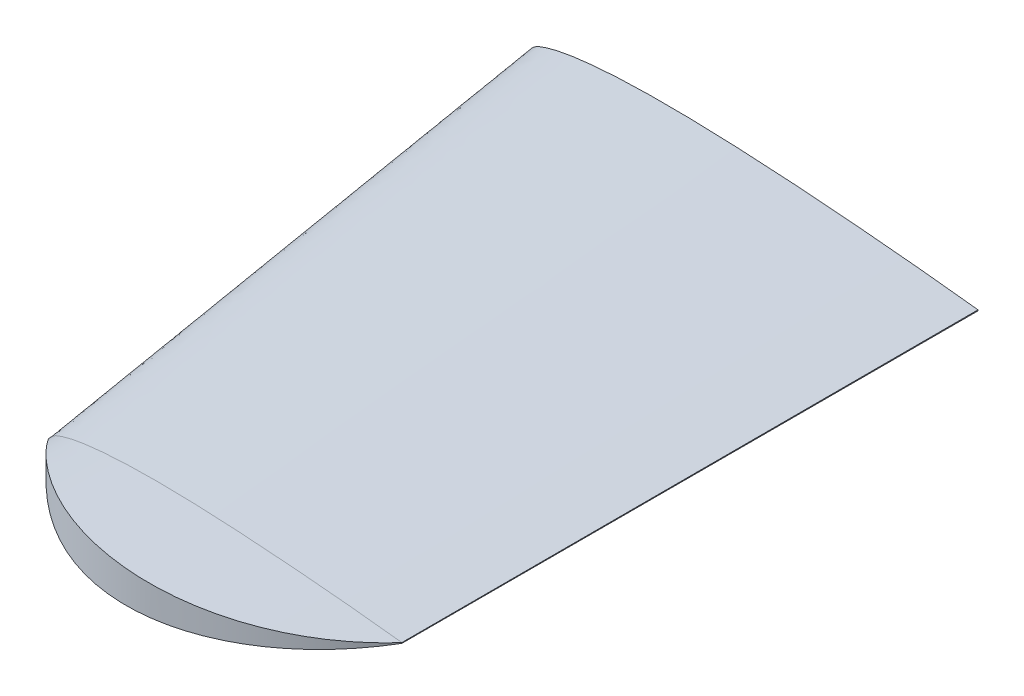
ISO-10303-21;
HEADER;
FILE_DESCRIPTION(('STEP AP214'),'2;1');
FILE_NAME('part.step','',(''),(''),'','','');
FILE_SCHEMA(('AUTOMOTIVE_DESIGN { 1 0 10303 214 1 1 1 1 }'));
ENDSEC;
DATA;
#1=APPLICATION_CONTEXT('core data for automotive mechanical design processes');
#2=APPLICATION_PROTOCOL_DEFINITION('international standard','automotive_design',2000,#1);
#3=PRODUCT_CONTEXT('',#1,'mechanical');
#4=PRODUCT('Part','Part','',(#3));
#5=PRODUCT_RELATED_PRODUCT_CATEGORY('part','',(#4));
#6=PRODUCT_DEFINITION_FORMATION('','',#4);
#7=PRODUCT_DEFINITION_CONTEXT('part definition',#1,'design');
#8=PRODUCT_DEFINITION('design','',#6,#7);
#9=PRODUCT_DEFINITION_SHAPE('','',#8);
#10=(LENGTH_UNIT() NAMED_UNIT(*) SI_UNIT(.MILLI.,.METRE.));
#11=(NAMED_UNIT(*) PLANE_ANGLE_UNIT() SI_UNIT($,.RADIAN.));
#12=(NAMED_UNIT(*) SI_UNIT($,.STERADIAN.) SOLID_ANGLE_UNIT());
#13=UNCERTAINTY_MEASURE_WITH_UNIT(LENGTH_MEASURE(1.E-05),#10,'distance_accuracy_value','');
#14=(GEOMETRIC_REPRESENTATION_CONTEXT(3) GLOBAL_UNCERTAINTY_ASSIGNED_CONTEXT((#13)) GLOBAL_UNIT_ASSIGNED_CONTEXT((#10,
#11,#12)) REPRESENTATION_CONTEXT('',''));
#15=CARTESIAN_POINT('',(0.,0.,0.));
#16=DIRECTION('',(0.,0.,1.));
#17=DIRECTION('',(1.,0.,0.));
#18=AXIS2_PLACEMENT_3D('',#15,#16,#17);
#19=CARTESIAN_POINT('',(70.,0.05775,109.));
#20=CARTESIAN_POINT('',(69.0834706028233,0.162933292202173,109.));
#21=CARTESIAN_POINT('',(67.2510502336686,0.373226609273861,109.));
#22=CARTESIAN_POINT('',(61.7553848437865,0.959042466652812,109.));
#23=CARTESIAN_POINT('',(55.3394586118436,1.55039879244607,109.));
#24=CARTESIAN_POINT('',(48.0026361314158,2.10425443765382,109.));
#25=CARTESIAN_POINT('',(42.5026146075089,2.44273926867048,109.));
#26=CARTESIAN_POINT('',(37.0022333956594,2.68357826413429,109.));
#27=CARTESIAN_POINT('',(31.4996996065971,2.78467192840338,109.));
#28=CARTESIAN_POINT('',(26.913095781954,2.70204539211904,109.));
#29=CARTESIAN_POINT('',(23.2446940719624,2.46936840687895,109.));
#30=CARTESIAN_POINT('',(20.9520523769744,2.22612280457962,109.));
#31=CARTESIAN_POINT('',(19.1173836840148,1.93450608205921,109.));
#32=CARTESIAN_POINT('',(17.7384539929173,1.64974740162797,109.));
#33=CARTESIAN_POINT('',(16.5660397070815,1.28794924622931,109.));
#34=CARTESIAN_POINT('',(15.5937114671287,0.878643213305847,109.));
#35=CARTESIAN_POINT('',(14.648433235888,0.,109.));
#36=CARTESIAN_POINT('',(15.5937114671287,-0.878643213305856,109.));
#37=CARTESIAN_POINT('',(16.5660397070814,-1.2879492462293,109.));
#38=CARTESIAN_POINT('',(17.7384539929173,-1.64974740162797,109.));
#39=CARTESIAN_POINT('',(19.1173836840148,-1.93450608205921,109.));
#40=CARTESIAN_POINT('',(20.9520523769745,-2.22612280457962,109.));
#41=CARTESIAN_POINT('',(23.2446940719624,-2.46936840687895,109.));
#42=CARTESIAN_POINT('',(26.913095781954,-2.70204539211904,109.));
#43=CARTESIAN_POINT('',(31.4996996065971,-2.78467192840338,109.));
#44=CARTESIAN_POINT('',(37.0022333956594,-2.68357826413429,109.));
#45=CARTESIAN_POINT('',(42.5026146075089,-2.44273926867048,109.));
#46=CARTESIAN_POINT('',(48.0026361314158,-2.10425443765382,109.));
#47=CARTESIAN_POINT('',(55.3394586118436,-1.55039879244607,109.));
#48=CARTESIAN_POINT('',(61.7553848437864,-0.959042466652813,109.));
#49=CARTESIAN_POINT('',(67.2510502336687,-0.37322660927386,109.));
#50=CARTESIAN_POINT('',(69.0834706028233,-0.162933292202173,109.));
#51=CARTESIAN_POINT('',(70.,-0.05775,109.));
#52=B_SPLINE_CURVE_WITH_KNOTS('',3,(#19,#20,#21,#22,#23,#24,#25,#26,#27,#28,#29,#30,#31,#32,#33,
#34,#35,#36,#37,#38,#39,#40,#41,#42,#43,#44,#45,#46,#47,#48,#49,#50,#51),.UNSPECIFIED.,.F.,.F.,
(4,1,1,1,1,1,1,1,1,1,1,1,1,1,1,1,1,1,1,1,1,1,1,1,1,1,1,1,1,1,4),(0.,0.0248235560251693,
0.0496298207515118,0.148712652883516,0.198182139774084,0.247604472837194,0.296979942928689,
0.34631759583347,0.395664019787251,0.420382181676291,0.445198050680487,0.457689209223658,
0.470304282792856,0.483229229601925,0.4900691736526,0.5,0.5099308263474,0.516770770398075,
0.529695717207144,0.542310790776342,0.554801949319513,0.579617818323709,0.604335980212749,
0.65368240416653,0.703020057071311,0.752395527162806,0.801817860225916,0.851287347116484,
0.950370179248488,0.975176443974831,1.),.UNSPECIFIED.);
#53=DIRECTION('',(0.,0.,-1.));
#54=VECTOR('',#53,1.);
#55=SURFACE_OF_LINEAR_EXTRUSION('',#52,#54);
#56=CARTESIAN_POINT('',(70.,0.05775,90.));
#57=CARTESIAN_POINT('',(69.0834706028233,0.162933292202173,90.));
#58=CARTESIAN_POINT('',(67.2510502336686,0.373226609273861,90.));
#59=CARTESIAN_POINT('',(61.7553848437865,0.959042466652812,90.));
#60=CARTESIAN_POINT('',(55.3394586118436,1.55039879244607,90.));
#61=CARTESIAN_POINT('',(48.0026361314158,2.10425443765382,90.));
#62=CARTESIAN_POINT('',(42.5026146075089,2.44273926867048,90.));
#63=CARTESIAN_POINT('',(37.0022333956594,2.68357826413429,90.));
#64=CARTESIAN_POINT('',(31.4996996065971,2.78467192840338,90.));
#65=CARTESIAN_POINT('',(26.913095781954,2.70204539211904,90.));
#66=CARTESIAN_POINT('',(23.2446940719624,2.46936840687895,90.));
#67=CARTESIAN_POINT('',(20.9520523769744,2.22612280457962,90.));
#68=CARTESIAN_POINT('',(19.1173836840148,1.93450608205921,90.));
#69=CARTESIAN_POINT('',(17.7384539929173,1.64974740162797,90.));
#70=CARTESIAN_POINT('',(16.5660397070815,1.28794924622931,90.));
#71=CARTESIAN_POINT('',(15.5937114671287,0.878643213305847,90.));
#72=CARTESIAN_POINT('',(14.648433235888,0.,90.));
#73=CARTESIAN_POINT('',(15.5937114671287,-0.878643213305856,90.));
#74=CARTESIAN_POINT('',(16.5660397070814,-1.2879492462293,90.));
#75=CARTESIAN_POINT('',(17.7384539929173,-1.64974740162797,90.));
#76=CARTESIAN_POINT('',(19.1173836840148,-1.93450608205921,90.));
#77=CARTESIAN_POINT('',(20.9520523769745,-2.22612280457962,90.));
#78=CARTESIAN_POINT('',(23.2446940719624,-2.46936840687895,90.));
#79=CARTESIAN_POINT('',(26.913095781954,-2.70204539211904,90.));
#80=CARTESIAN_POINT('',(31.4996996065971,-2.78467192840338,90.));
#81=CARTESIAN_POINT('',(37.0022333956594,-2.68357826413429,90.));
#82=CARTESIAN_POINT('',(42.5026146075089,-2.44273926867048,90.));
#83=CARTESIAN_POINT('',(48.0026361314158,-2.10425443765382,90.));
#84=CARTESIAN_POINT('',(55.3394586118436,-1.55039879244607,90.));
#85=CARTESIAN_POINT('',(61.7553848437864,-0.959042466652813,90.));
#86=CARTESIAN_POINT('',(67.2510502336687,-0.37322660927386,90.));
#87=CARTESIAN_POINT('',(69.0834706028233,-0.162933292202173,90.));
#88=CARTESIAN_POINT('',(70.,-0.05775,90.));
#89=B_SPLINE_CURVE_WITH_KNOTS('',3,(#56,#57,#58,#59,#60,#61,#62,#63,#64,#65,#66,#67,#68,#69,#70,
#71,#72,#73,#74,#75,#76,#77,#78,#79,#80,#81,#82,#83,#84,#85,#86,#87,#88),.UNSPECIFIED.,.F.,.F.,
(4,1,1,1,1,1,1,1,1,1,1,1,1,1,1,1,1,1,1,1,1,1,1,1,1,1,1,1,1,1,4),(0.,0.0248235560251693,
0.0496298207515118,0.148712652883516,0.198182139774084,0.247604472837194,0.296979942928689,
0.34631759583347,0.395664019787251,0.420382181676291,0.445198050680487,0.457689209223658,
0.470304282792856,0.483229229601925,0.4900691736526,0.5,0.5099308263474,0.516770770398075,
0.529695717207144,0.542310790776342,0.554801949319513,0.579617818323709,0.604335980212749,
0.65368240416653,0.703020057071311,0.752395527162806,0.801817860225916,0.851287347116484,
0.950370179248488,0.975176443974831,1.),.UNSPECIFIED.);
#90=CARTESIAN_POINT('',(15.,2.84928330929191E-13,90.));
#91=VERTEX_POINT('',#90);
#92=CARTESIAN_POINT('',(70.,-0.0577500000000001,90.));
#93=VERTEX_POINT('',#92);
#94=EDGE_CURVE('E112',#91,#93,#89,.T.);
#95=ORIENTED_EDGE('',*,*,#94,.T.);
#96=CARTESIAN_POINT('',(70.,-0.05775,90.));
#97=CARTESIAN_POINT('',(69.8118934829,-0.079334502756125,90.2586484333623));
#98=CARTESIAN_POINT('',(69.6201531882203,-0.10134195545907,90.5146182030326));
#99=CARTESIAN_POINT('',(69.2295625030477,-0.14609906974158,91.0210065060022));
#100=CARTESIAN_POINT('',(69.0307121390234,-0.168848728558125,91.2714250599612));
#101=CARTESIAN_POINT('',(68.6260707782587,-0.214985197701111,91.7665025481613));
#102=CARTESIAN_POINT('',(68.4202802422861,-0.238371965709238,92.0111618629422));
#103=CARTESIAN_POINT('',(68.0019081992867,-0.285663464739525,92.4945516565532));
#104=CARTESIAN_POINT('',(67.7893266856677,-0.309568196264484,92.7332821296274));
#105=CARTESIAN_POINT('',(67.357538581091,-0.357740799014813,93.2046314485688));
#106=CARTESIAN_POINT('',(67.1383321248256,-0.38200866285225,93.4372504185101));
#107=CARTESIAN_POINT('',(66.6934706181261,-0.430817201266536,93.8961948488));
#108=CARTESIAN_POINT('',(66.4678155741656,-0.455357875569502,94.122520315466));
#109=CARTESIAN_POINT('',(65.7817552811507,-0.529333350510178,94.7914835922411));
#110=CARTESIAN_POINT('',(65.3119153517711,-0.579159525161269,95.224478856236));
#111=CARTESIAN_POINT('',(64.3486773517193,-0.67975259680538,96.0632531990286));
#112=CARTESIAN_POINT('',(63.8552794184302,-0.730519488311366,96.4690324365089));
#113=CARTESIAN_POINT('',(62.8464892906954,-0.832696284205963,97.2521224889948));
#114=CARTESIAN_POINT('',(62.3310971762375,-0.884106186255608,97.6294334075194));
#115=CARTESIAN_POINT('',(61.016783622463,-1.01300032034807,98.5358747791108));
#116=CARTESIAN_POINT('',(60.2050186749418,-1.09066125195067,99.0465161659495));
#117=CARTESIAN_POINT('',(58.541300376186,-1.24543597725719,99.9974162107447));
#118=CARTESIAN_POINT('',(57.689346693351,-1.32254976644055,100.437674287831));
#119=CARTESIAN_POINT('',(55.9513161340534,-1.47511582530627,101.244676776894));
#120=CARTESIAN_POINT('',(55.0652451467195,-1.55056837823854,101.611433808973));
#121=CARTESIAN_POINT('',(53.2651167923811,-1.69890416321023,102.268877804154));
#122=CARTESIAN_POINT('',(52.3510595289555,-1.7717874047567,102.559565048757));
#123=CARTESIAN_POINT('',(50.5006914229352,-1.9135943621107,103.062953863837));
#124=CARTESIAN_POINT('',(49.5643648024791,-1.98251514476667,103.275598275461));
#125=CARTESIAN_POINT('',(47.6766902536329,-2.11479184122355,103.621012783044));
#126=CARTESIAN_POINT('',(46.7253422555785,-2.17814772920732,103.753782508459));
#127=CARTESIAN_POINT('',(44.8142780392513,-2.29765089049779,103.938413248791));
#128=CARTESIAN_POINT('',(43.8545608058054,-2.35379727594208,103.990264307191));
#129=CARTESIAN_POINT('',(41.9336255303998,-2.45740136297074,104.012520652735));
#130=CARTESIAN_POINT('',(40.9724075062912,-2.50485916711835,103.98292690135));
#131=CARTESIAN_POINT('',(39.3789263803534,-2.57471877733323,103.86613050997));
#132=CARTESIAN_POINT('',(38.7450323914456,-2.60017336332852,103.801718153824));
#133=CARTESIAN_POINT('',(37.4816270418381,-2.64573709338253,103.637354313841));
#134=CARTESIAN_POINT('',(36.8521157047484,-2.66584620866609,103.537402638699));
#135=CARTESIAN_POINT('',(35.5995500354822,-2.70013305880178,103.302251065589));
#136=CARTESIAN_POINT('',(34.9764958710373,-2.71431063995118,103.167050254364));
#137=CARTESIAN_POINT('',(33.7387176812229,-2.73609459879822,102.861774741505));
#138=CARTESIAN_POINT('',(33.123995070784,-2.74369987376452,102.69169419351));
#139=CARTESIAN_POINT('',(32.2098573200916,-2.74982681027168,102.410872112353));
#140=CARTESIAN_POINT('',(31.9064570220052,-2.7509889001453,102.312976742497));
#141=CARTESIAN_POINT('',(31.3025265809814,-2.75151688221958,102.108693558614));
#142=CARTESIAN_POINT('',(31.0019964387203,-2.75088277399701,102.002305742585));
#143=CARTESIAN_POINT('',(30.1051653007532,-2.74608630896635,101.670559354528));
#144=CARTESIAN_POINT('',(29.5134947746762,-2.73903076594242,101.432578263353));
#145=CARTESIAN_POINT('',(28.3530708283405,-2.71646561729985,100.927479651691));
#146=CARTESIAN_POINT('',(27.7841096123514,-2.70107992356975,100.660833998042));
#147=CARTESIAN_POINT('',(26.9426153324437,-2.67130477064247,100.237665661538));
#148=CARTESIAN_POINT('',(26.664082469302,-2.66026224326963,100.092727958074));
#149=CARTESIAN_POINT('',(26.1112056883505,-2.63591863121479,99.7952336592467));
#150=CARTESIAN_POINT('',(25.8368617699982,-2.62261754682533,99.6426770648702));
#151=CARTESIAN_POINT('',(25.2925030703158,-2.5936513674788,99.3300291126069));
#152=CARTESIAN_POINT('',(25.0224898330427,-2.57798544922042,99.1699351440425));
#153=CARTESIAN_POINT('',(24.4871121339346,-2.54414007753929,98.8424053315635));
#154=CARTESIAN_POINT('',(24.2217476794038,-2.52596062016762,98.6749694761147));
#155=CARTESIAN_POINT('',(23.6962340806618,-2.48701861395086,98.3331345391999));
#156=CARTESIAN_POINT('',(23.4360785331452,-2.46625949566464,98.1587449105439));
#157=CARTESIAN_POINT('',(22.9208390791168,-2.42204425687157,97.8029579189326));
#158=CARTESIAN_POINT('',(22.6657551469089,-2.3985881500335,97.6215605914966));
#159=CARTESIAN_POINT('',(22.1609676117037,-2.34865636390494,97.2520013094522));
#160=CARTESIAN_POINT('',(21.9112622406764,-2.3221816954515,97.0638416337464));
#161=CARTESIAN_POINT('',(21.4173594070308,-2.26595249577677,96.6808904450366));
#162=CARTESIAN_POINT('',(21.1731620353547,-2.23619791044862,96.4860988226659));
#163=CARTESIAN_POINT('',(20.6907656712911,-2.1732836242187,96.0903147791394));
#164=CARTESIAN_POINT('',(20.4525601408357,-2.14012785484449,95.8893297011446));
#165=CARTESIAN_POINT('',(19.9820799948738,-2.07015341602583,95.4811744833319));
#166=CARTESIAN_POINT('',(19.7498050125752,-2.03333497380316,95.2740047277511));
#167=CARTESIAN_POINT('',(19.3557823749026,-1.96664766286717,94.9127516631362));
#168=CARTESIAN_POINT('',(19.1925527972857,-1.9377321754484,94.7601047404928));
#169=CARTESIAN_POINT('',(18.8693398387987,-1.87763384641819,94.451825490831));
#170=CARTESIAN_POINT('',(18.7093566397936,-1.84645087822654,94.2961929975032));
#171=CARTESIAN_POINT('',(18.3926872137677,-1.78091580141281,93.9820194489676));
#172=CARTESIAN_POINT('',(18.2360035499594,-1.74656133304057,93.823476299509));
#173=CARTESIAN_POINT('',(17.9259610660701,-1.67397424458427,93.5035381842634));
#174=CARTESIAN_POINT('',(17.7726078650199,-1.63573560782415,93.3421391240163));
#175=CARTESIAN_POINT('',(17.5450496926564,-1.57510940655339,93.097898397851));
#176=CARTESIAN_POINT('',(17.4694531179804,-1.5543089281039,93.0159538352795));
#177=CARTESIAN_POINT('',(17.3192044667665,-1.51164366779619,92.8514757074614));
#178=CARTESIAN_POINT('',(17.2445523980802,-1.48977887709778,92.7689421373274));
#179=CARTESIAN_POINT('',(17.0962187262395,-1.4449584683366,92.6033239480428));
#180=CARTESIAN_POINT('',(17.0225369816314,-1.42200301157062,92.5202394119278));
#181=CARTESIAN_POINT('',(16.8761504655261,-1.3749593742476,92.3535375115462));
#182=CARTESIAN_POINT('',(16.8034456594275,-1.35087123394476,92.2699201663061));
#183=CARTESIAN_POINT('',(16.659176196707,-1.30156228744237,92.1023533173895));
#184=CARTESIAN_POINT('',(16.5876094921391,-1.27634392815019,92.0184048590633));
#185=CARTESIAN_POINT('',(16.4810121994114,-1.23756008824357,91.8921289398268));
#186=CARTESIAN_POINT('',(16.4456022116082,-1.22447158954632,91.8499744486279));
#187=CARTESIAN_POINT('',(16.3750337674818,-1.19799045873814,91.7655499707131));
#188=CARTESIAN_POINT('',(16.3398753128686,-1.18459782456212,91.7232799832147));
#189=CARTESIAN_POINT('',(16.2699364552881,-1.15735111967864,91.6387792051845));
#190=CARTESIAN_POINT('',(16.2351552860491,-1.14349839770399,91.5965486188224));
#191=CARTESIAN_POINT('',(16.1659249656008,-1.11501945246384,91.5120774472771));
#192=CARTESIAN_POINT('',(16.1314758125746,-1.10039323343358,91.46983686215));
#193=CARTESIAN_POINT('',(16.0287204135252,-1.05499802224081,91.34322276949));
#194=CARTESIAN_POINT('',(15.9609772363479,-1.02270163094829,91.2589218884715));
#195=CARTESIAN_POINT('',(15.8490792912944,-0.96397053407142,91.1183257383604));
#196=CARTESIAN_POINT('',(15.8044034976008,-0.939034558826347,91.0618196038232));
#197=CARTESIAN_POINT('',(15.7159881091848,-0.886395153851384,90.9492680530181));
#198=CARTESIAN_POINT('',(15.6722494090695,-0.8586892112233,90.8932231059378));
#199=CARTESIAN_POINT('',(15.5857210408771,-0.800329400690177,90.7816405394716));
#200=CARTESIAN_POINT('',(15.5429343563907,-0.769667534686952,90.7261047685763));
#201=CARTESIAN_POINT('',(15.459128885396,-0.705413926133256,90.6166434045337));
#202=CARTESIAN_POINT('',(15.4180952166259,-0.671860922945314,90.5627065525421));
#203=CARTESIAN_POINT('',(15.3376921230377,-0.600751166028611,90.4563791629746));
#204=CARTESIAN_POINT('',(15.2983197721671,-0.563201900345303,90.4039859603243));
#205=CARTESIAN_POINT('',(15.241149717198,-0.502706881048774,90.3274714871478));
#206=CARTESIAN_POINT('',(15.222438855712,-0.481886715629266,90.30235466876));
#207=CARTESIAN_POINT('',(15.1858226786921,-0.438503832857263,90.2530653304506));
#208=CARTESIAN_POINT('',(15.1679168754899,-0.415942193545162,90.2288922400621));
#209=CARTESIAN_POINT('',(15.1407020491774,-0.378793990312578,90.192055198901));
#210=CARTESIAN_POINT('',(15.1310115035105,-0.364957028796117,90.1789178020207));
#211=CARTESIAN_POINT('',(15.1120872383177,-0.33643254306559,90.1532252677733));
#212=CARTESIAN_POINT('',(15.1028537489302,-0.321744598280035,90.1406704239304));
#213=CARTESIAN_POINT('',(15.0850202981367,-0.291440405691743,90.1163891870689));
#214=CARTESIAN_POINT('',(15.0764180221504,-0.27582797247077,90.1046597745262));
#215=CARTESIAN_POINT('',(15.0600155519695,-0.243468536858013,90.0822669434238));
#216=CARTESIAN_POINT('',(15.0522145879756,-0.226722649500943,90.0716025020539));
#217=CARTESIAN_POINT('',(15.0382394988738,-0.193183853497894,90.052477156001));
#218=CARTESIAN_POINT('',(15.0319881451006,-0.176483824835564,90.043912169933));
#219=CARTESIAN_POINT('',(15.0207820243357,-0.141846500632823,90.0285463763951));
#220=CARTESIAN_POINT('',(15.0158271290763,-0.123909327713884,90.0217453944004));
#221=CARTESIAN_POINT('',(15.008310416492,-0.0896545961463573,90.0114227075847));
#222=CARTESIAN_POINT('',(15.0055013260208,-0.0734968397684083,90.0075624112534));
#223=CARTESIAN_POINT('',(15.0015056101006,-0.0406266290664047,90.0020703522854));
#224=CARTESIAN_POINT('',(15.0003148146027,-0.0239157145217641,90.0004328618985));
#225=CARTESIAN_POINT('',(14.9997963351233,0.00966589098437874,89.9997199685532));
#226=CARTESIAN_POINT('',(15.0004765568622,0.0265369588272543,90.0006554372708));
#227=CARTESIAN_POINT('',(15.0035554388003,0.05983104366016,90.0048879693968));
#228=CARTESIAN_POINT('',(15.0059580448406,0.0762529417950893,90.0081904554443));
#229=CARTESIAN_POINT('',(15.0133453643444,0.114459702043663,90.0183383224309));
#230=CARTESIAN_POINT('',(15.0189673907786,0.135881820822151,90.0260572888571));
#231=CARTESIAN_POINT('',(15.0320615205449,0.17702379621128,90.0440135407957));
#232=CARTESIAN_POINT('',(15.0395381600518,0.196739316761911,90.0542570005313));
#233=CARTESIAN_POINT('',(15.0555641006512,0.234158324160863,90.0761828714443));
#234=CARTESIAN_POINT('',(15.0640841229043,0.251898161898692,90.0878258880981));
#235=CARTESIAN_POINT('',(15.0819913006992,0.286115984030853,90.1122606611594));
#236=CARTESIAN_POINT('',(15.091379336293,0.302592656094741,90.1250535830466));
#237=CARTESIAN_POINT('',(15.1108151130325,0.334508781978195,90.1514967512735));
#238=CARTESIAN_POINT('',(15.1208645059637,0.349945427622153,90.1651491401949));
#239=CARTESIAN_POINT('',(15.1414465312778,0.379892824358954,90.1930644849865));
#240=CARTESIAN_POINT('',(15.1519789281269,0.394404018659899,90.2073271430403));
#241=CARTESIAN_POINT('',(15.1814183647682,0.433170674391142,90.2471253511483));
#242=CARTESIAN_POINT('',(15.2007187657077,0.456631532263737,90.2731430681159));
#243=CARTESIAN_POINT('',(15.2401529159643,0.501708612619999,90.3261366933969));
#244=CARTESIAN_POINT('',(15.2602871589174,0.523323718547008,90.3531131679168));
#245=CARTESIAN_POINT('',(15.3217068402535,0.586023259549926,90.4351422575078));
#246=CARTESIAN_POINT('',(15.3639359817362,0.624870925846391,90.4911953936491));
#247=CARTESIAN_POINT('',(15.4502454049335,0.69844861237005,90.6049973919222));
#248=CARTESIAN_POINT('',(15.4943331506165,0.733159349987477,90.662752740818));
#249=CARTESIAN_POINT('',(15.5837587611261,0.799055915270753,90.7791080781212));
#250=CARTESIAN_POINT('',(15.6290944350483,0.830247484519262,90.8377065095668));
#251=CARTESIAN_POINT('',(15.7227869913942,0.890721429423716,90.9579796674983));
#252=CARTESIAN_POINT('',(15.7711916474634,0.919873829386028,91.0196823010348));
#253=CARTESIAN_POINT('',(15.869129809791,0.974965852707334,91.1436276474864));
#254=CARTESIAN_POINT('',(15.918663412838,1.00090519936406,91.2058704064231));
#255=CARTESIAN_POINT('',(16.0187963535583,1.05005767091457,91.3307823060708));
#256=CARTESIAN_POINT('',(16.069397575027,1.07326540058998,91.3934520402757));
#257=CARTESIAN_POINT('',(16.1714126670752,1.11755929333518,91.5188759796862));
#258=CARTESIAN_POINT('',(16.2228265745463,1.13864535977076,91.5816301886076));
#259=CARTESIAN_POINT('',(16.3005030248039,1.16932021884864,91.6757472703393));
#260=CARTESIAN_POINT('',(16.3265202924578,1.17939800146238,91.707156091724));
#261=CARTESIAN_POINT('',(16.3786998708558,1.19934872839107,91.7699183479463));
#262=CARTESIAN_POINT('',(16.4048621814875,1.20922167286485,91.8012717828268));
#263=CARTESIAN_POINT('',(16.4835568739928,1.23857778404294,91.8952360939513));
#264=CARTESIAN_POINT('',(16.5362990035923,1.25779900450642,91.9577533844914));
#265=CARTESIAN_POINT('',(16.6423499761759,1.29556484979689,92.0825415559185));
#266=CARTESIAN_POINT('',(16.6956589686536,1.31410929012586,92.1448123655478));
#267=CARTESIAN_POINT('',(16.8028206668032,1.35054892423923,92.2690751038138));
#268=CARTESIAN_POINT('',(16.8566733730294,1.36844411736173,92.3310670321661));
#269=CARTESIAN_POINT('',(17.0193062863098,1.42127677138771,92.5169135599104));
#270=CARTESIAN_POINT('',(17.1288981960428,1.45526788007201,92.6403292692013));
#271=CARTESIAN_POINT('',(17.3499877696278,1.5208054893146,92.8856746935068));
#272=CARTESIAN_POINT('',(17.4614816193093,1.55235630902339,93.0076066964303));
#273=CARTESIAN_POINT('',(17.6864210433705,1.61308913124903,93.2500239292108));
#274=CARTESIAN_POINT('',(17.799864589885,1.64227343350957,93.3705104643052));
#275=CARTESIAN_POINT('',(18.0287440238346,1.69840030596391,93.6100628521033));
#276=CARTESIAN_POINT('',(18.1441795583642,1.7253432684144,93.7291289502599));
#277=CARTESIAN_POINT('',(18.3631942778947,1.77418005606437,93.9517434710449));
#278=CARTESIAN_POINT('',(18.4665561859439,1.79629375377782,94.0554577336268));
#279=CARTESIAN_POINT('',(18.6747536664995,1.83918115214984,94.2616797784426));
#280=CARTESIAN_POINT('',(18.7795892620666,1.85995483181091,94.3641875417506));
#281=CARTESIAN_POINT('',(18.9906976345851,1.90040099576179,94.567951183012));
#282=CARTESIAN_POINT('',(19.0969705373656,1.92007338285395,94.6692069498543));
#283=CARTESIAN_POINT('',(19.3109042089208,1.95851642867873,94.8704121881897));
#284=CARTESIAN_POINT('',(19.4185649737819,1.97728708995337,94.9703616633648));
#285=CARTESIAN_POINT('',(19.7439436304285,2.03231493395118,95.2685286372134));
#286=CARTESIAN_POINT('',(19.9637304851005,2.06722561802749,95.4647486244752));
#287=CARTESIAN_POINT('',(20.4085929140386,2.13376319229076,95.8516277207731));
#288=CARTESIAN_POINT('',(20.6336682914775,2.16539020445213,96.042287036175));
#289=CARTESIAN_POINT('',(21.3168235344915,2.25564297205459,96.6058556648412));
#290=CARTESIAN_POINT('',(21.7826690622387,2.30961317220866,96.9702058281554));
#291=CARTESIAN_POINT('',(22.49536869946,2.38220471179813,97.4982194169695));
#292=CARTESIAN_POINT('',(22.7351050844992,2.40499645447372,97.6710378398305));
#293=CARTESIAN_POINT('',(23.2191611918285,2.44811090973403,98.0104732565837));
#294=CARTESIAN_POINT('',(23.4634809162774,2.4684336211558,98.1770902475549));
#295=CARTESIAN_POINT('',(23.9563777533751,2.50673495919545,98.5038851992991));
#296=CARTESIAN_POINT('',(24.2049525288687,2.52471482869614,98.6640665427437));
#297=CARTESIAN_POINT('',(24.7063048523891,2.55840305546334,98.9779550751545));
#298=CARTESIAN_POINT('',(24.9590823561804,2.57411143662141,99.1316623322034));
#299=CARTESIAN_POINT('',(25.4686169045907,2.60336302930642,99.4324565598221));
#300=CARTESIAN_POINT('',(25.7253733198124,2.61690657951491,99.579544563363));
#301=CARTESIAN_POINT('',(26.24271937853,2.64196221032049,99.8670121074459));
#302=CARTESIAN_POINT('',(26.50330917282,2.65347421076954,100.007391383158));
#303=CARTESIAN_POINT('',(27.1630843542605,2.6798991950498,100.351769011146));
#304=CARTESIAN_POINT('',(27.5646347008446,2.69351713847356,100.551363453979));
#305=CARTESIAN_POINT('',(28.3754054132886,2.7163159362093,100.934559580835));
#306=CARTESIAN_POINT('',(28.7846262263615,2.72549653096843,101.118160328828));
#307=CARTESIAN_POINT('',(30.0228682597251,2.74673162345303,101.644514292287));
#308=CARTESIAN_POINT('',(30.8625452036443,2.75248238727559,101.962858959955));
#309=CARTESIAN_POINT('',(32.5645791606726,2.74975575525323,102.532187648915));
#310=CARTESIAN_POINT('',(33.4269433161327,2.74127382463186,102.783150171563));
#311=CARTESIAN_POINT('',(35.168607074125,2.71121710240577,103.216047043278));
#312=CARTESIAN_POINT('',(36.0479064812839,2.68964246175731,103.397982188178));
#313=CARTESIAN_POINT('',(37.8552982065382,2.63405569222706,103.697938526654));
#314=CARTESIAN_POINT('',(38.7838797320827,2.59955547701703,103.812926261085));
#315=CARTESIAN_POINT('',(40.6469318562782,2.52003601913924,103.96600955558));
#316=CARTESIAN_POINT('',(41.581402684175,2.47501636450218,104.004102103659));
#317=CARTESIAN_POINT('',(43.4498612218187,2.37653662346329,104.003243253796));
#318=CARTESIAN_POINT('',(44.3838489296192,2.32307650331692,103.964291547828));
#319=CARTESIAN_POINT('',(46.2450220109273,2.20909234499443,103.809713881501));
#320=CARTESIAN_POINT('',(47.1722073858974,2.14856830833701,103.694087937627));
#321=CARTESIAN_POINT('',(49.0295275430063,2.02088531485916,103.384384027208));
#322=CARTESIAN_POINT('',(49.9594339035979,1.953629385278,103.188978476378));
#323=CARTESIAN_POINT('',(51.7994739559656,1.81484987513888,102.721104267782));
#324=CARTESIAN_POINT('',(52.7096072225907,1.74332620294173,102.44863395477));
#325=CARTESIAN_POINT('',(54.0551366726114,1.63399238310283,101.983658400469));
#326=CARTESIAN_POINT('',(54.5005066900321,1.59719435354967,101.819226904036));
#327=CARTESIAN_POINT('',(55.3839303949494,1.52302245826422,101.471884564911));
#328=CARTESIAN_POINT('',(55.821984572132,1.48564863139751,101.288974964876));
#329=CARTESIAN_POINT('',(56.6899647303163,1.41045192134921,100.905017072796));
#330=CARTESIAN_POINT('',(57.119891711467,1.37262909436744,100.703971030466));
#331=CARTESIAN_POINT('',(57.9710192989994,1.29664891180937,100.284036598962));
#332=CARTESIAN_POINT('',(58.3922176267683,1.25849147249194,100.065143622638));
#333=CARTESIAN_POINT('',(59.6494166315292,1.14299788671316,99.3779705225926));
#334=CARTESIAN_POINT('',(60.4708814417585,1.06534796513693,98.8827943162658));
#335=CARTESIAN_POINT('',(62.0690633016342,0.910394805013369,97.8248114228515));
#336=CARTESIAN_POINT('',(62.8457807562897,0.833091563334065,97.2620053480255));
#337=CARTESIAN_POINT('',(63.9725927069767,0.718377640985267,96.3705710483275));
#338=CARTESIAN_POINT('',(64.3416481710958,0.680364777496786,96.0657160310677));
#339=CARTESIAN_POINT('',(65.0665381486958,0.604867555016506,95.4407203417822));
#340=CARTESIAN_POINT('',(65.4223755047383,0.567383083482294,95.1205829904674));
#341=CARTESIAN_POINT('',(66.1201196676806,0.492988917005486,94.4656665463817));
#342=CARTESIAN_POINT('',(66.4620313506371,0.456079023720878,94.1308926652042));
#343=CARTESIAN_POINT('',(67.1314400927647,0.382851651914143,93.4471961266338));
#344=CARTESIAN_POINT('',(67.4589381995637,0.346534130457571,93.0982745011011));
#345=CARTESIAN_POINT('',(67.9758600326703,0.288600459826525,92.5237044785461));
#346=CARTESIAN_POINT('',(68.1699441080557,0.266702201887748,92.3022572900858));
#347=CARTESIAN_POINT('',(68.552280083715,0.223377119368423,91.8544129270242));
#348=CARTESIAN_POINT('',(68.7405331915327,0.201950197448196,91.6280167940978));
#349=CARTESIAN_POINT('',(69.1108185789993,0.159687253700934,91.1707520697423));
#350=CARTESIAN_POINT('',(69.2928604609607,0.13885032911784,90.939891335133));
#351=CARTESIAN_POINT('',(69.6509598655867,0.0978064973851143,90.4734428531034));
#352=CARTESIAN_POINT('',(69.8270161376408,0.0775997219685267,90.2378541339902));
#353=CARTESIAN_POINT('',(70.,0.05775,90.));
#354=B_SPLINE_CURVE_WITH_KNOTS('',3,(#96,#97,#98,#99,#100,#101,#102,#103,#104,#105,#106,#107,
#108,#109,#110,#111,#112,#113,#114,#115,#116,#117,#118,#119,#120,#121,#122,#123,#124,#125,#126,
#127,#128,#129,#130,#131,#132,#133,#134,#135,#136,#137,#138,#139,#140,#141,#142,#143,#144,#145,
#146,#147,#148,#149,#150,#151,#152,#153,#154,#155,#156,#157,#158,#159,#160,#161,#162,#163,#164,
#165,#166,#167,#168,#169,#170,#171,#172,#173,#174,#175,#176,#177,#178,#179,#180,#181,#182,#183,
#184,#185,#186,#187,#188,#189,#190,#191,#192,#193,#194,#195,#196,#197,#198,#199,#200,#201,#202,
#203,#204,#205,#206,#207,#208,#209,#210,#211,#212,#213,#214,#215,#216,#217,#218,#219,#220,#221,
#222,#223,#224,#225,#226,#227,#228,#229,#230,#231,#232,#233,#234,#235,#236,#237,#238,#239,#240,
#241,#242,#243,#244,#245,#246,#247,#248,#249,#250,#251,#252,#253,#254,#255,#256,#257,#258,#259,
#260,#261,#262,#263,#264,#265,#266,#267,#268,#269,#270,#271,#272,#273,#274,#275,#276,#277,#278,
#279,#280,#281,#282,#283,#284,#285,#286,#287,#288,#289,#290,#291,#292,#293,#294,#295,#296,#297,
#298,#299,#300,#301,#302,#303,#304,#305,#306,#307,#308,#309,#310,#311,#312,#313,#314,#315,#316,
#317,#318,#319,#320,#321,#322,#323,#324,#325,#326,#327,#328,#329,#330,#331,#332,#333,#334,#335,
#336,#337,#338,#339,#340,#341,#342,#343,#344,#345,#346,#347,#348,#349,#350,#351,#352,#353),
.UNSPECIFIED.,.F.,.F.,(4,2,2,2,2,2,2,2,2,2,2,2,2,2,2,2,2,2,2,2,2,2,2,2,2,2,2,2,2,2,2,2,2,2,2,2,
2,2,2,2,2,2,2,2,2,2,2,2,2,2,2,2,2,2,2,2,2,2,2,2,2,2,2,2,2,2,2,2,2,2,2,2,2,2,2,2,2,2,2,2,2,2,2,2,
2,2,2,2,2,2,2,2,2,2,2,2,2,2,2,2,2,2,2,2,2,2,2,2,2,2,2,2,2,2,2,2,2,2,2,2,2,2,2,2,2,2,2,2,4),(0.,
0.961601562623352,1.92319954588826,2.88473381250497,3.84626901254751,4.80778467666606,
5.7692993755739,7.69081885501778,9.61232713010744,11.5338284176977,14.4166859339113,
17.299567240972,20.1819531334561,23.0643283593352,25.9488104542649,28.8333059304284,
31.7181562970782,34.602972607688,36.5150421193755,38.4271219236981,40.3392512723219,
42.2517013844304,43.2080035755846,44.1643059920677,46.0765071382351,47.961015697555,
48.9034499855978,49.8458841515642,50.7886471797061,51.7314116889989,52.6729356182853,
53.6144547759884,54.5556595645716,55.496879881979,56.4370242198958,57.377110270266,
58.0531012161961,58.7291299277634,59.4056657551023,60.0832660151348,60.4234949514124,
60.7637267141142,61.1039083161775,61.4440778377241,61.7835434640472,61.9533055243751,
62.1230687377377,62.2923719299928,62.4616741953327,62.8001385404639,63.0287705493641,
63.257611887119,63.4870907953739,63.7138682945788,63.9402281084859,64.053014262046,
64.1657311480428,64.2299084745226,64.2941177937448,64.3580784953966,64.4219771654422,
64.4812058866957,64.5404287458158,64.590781446644,64.6410041502116,64.6914393883609,
64.7419905402597,64.8119576160234,64.8820975405798,64.950592018548,65.019156718807,
65.0878996888663,65.1566094860862,65.2765081224527,65.3964787831178,65.636877941155,
65.8783570945405,66.1194363924195,66.370360267187,66.6213057360577,66.8727388134548,
67.1241833375556,67.2502177072879,67.3762519792826,67.6283108731718,67.8804379755862,
68.1325653350369,68.6380705518163,69.142659548146,69.6467521652169,70.1507563746652,
70.5949945034554,71.0392395915734,71.4835238261662,71.9278068082163,72.8177502379077,
73.707660598162,75.4881506427699,76.3773002307629,77.2664502375575,78.1551266110618,
79.0437936367683,79.9323214967162,80.8208844027412,82.1663499632274,83.51189421421,
86.2027257039216,88.8944147007237,91.5860726634921,94.3917358639492,97.1975089600789,
100.003293273826,102.809076984344,105.663588071839,108.51816047495,109.94635603972,
111.374455621893,112.802378299895,114.230669157024,117.113948911161,119.997202564579,
121.437421406325,122.87732871369,124.316727427102,125.75602134673,126.641756910385,
127.527307802408,128.411421162539,129.295718124682),.UNSPECIFIED.);
#355=EDGE_CURVE('E12',#93,#91,#354,.T.);
#356=ORIENTED_EDGE('',*,*,#355,.T.);
#357=EDGE_LOOP('',(#95,#356));
#358=FACE_BOUND('',#357,.T.);
#359=ADVANCED_FACE('F67',(#358),#55,.F.);
#360=CARTESIAN_POINT('',(70.,0.0735,0.));
#361=CARTESIAN_POINT('',(70.,0.05775,90.));
#362=CARTESIAN_POINT('',(68.8335080399569,0.207369644620947,0.));
#363=CARTESIAN_POINT('',(69.0834706028233,0.162933292202173,90.));
#364=CARTESIAN_POINT('',(66.5013366610328,0.475015684530368,0.));
#365=CARTESIAN_POINT('',(67.2510502336686,0.373226609273861,90.));
#366=CARTESIAN_POINT('',(59.5068534375464,1.22059950301267,0.));
#367=CARTESIAN_POINT('',(61.7553848437865,0.959042466652812,90.));
#368=CARTESIAN_POINT('',(51.3411291423464,1.97323482674955,0.));
#369=CARTESIAN_POINT('',(55.3394586118436,1.55039879244607,90.));
#370=CARTESIAN_POINT('',(42.0033550763474,2.6781420115594,0.));
#371=CARTESIAN_POINT('',(48.0026361314158,2.10425443765382,90.));
#372=CARTESIAN_POINT('',(35.0033276822841,3.10894088739879,0.));
#373=CARTESIAN_POINT('',(42.5026146075089,2.44273926867048,90.));
#374=CARTESIAN_POINT('',(28.0028425035665,3.41546324526182,0.));
#375=CARTESIAN_POINT('',(37.0022333956594,2.68357826413429,90.));
#376=CARTESIAN_POINT('',(20.9996176811236,3.54412790887703,0.));
#377=CARTESIAN_POINT('',(31.4996996065971,2.78467192840338,90.));
#378=CARTESIAN_POINT('',(15.1621219043051,3.43896686269696,0.));
#379=CARTESIAN_POINT('',(26.913095781954,2.70204539211904,90.));
#380=CARTESIAN_POINT('',(10.4932470006794,3.14283251784594,0.));
#381=CARTESIAN_POINT('',(23.2446940719624,2.46936840687895,90.));
#382=CARTESIAN_POINT('',(7.57533938887657,2.83324720582861,0.));
#383=CARTESIAN_POINT('',(20.9520523769744,2.22612280457962,90.));
#384=CARTESIAN_POINT('',(5.24030650692798,2.46209864989354,0.));
#385=CARTESIAN_POINT('',(19.1173836840148,1.93450608205921,90.));
#386=CARTESIAN_POINT('',(3.48530508189471,2.09967851116287,0.));
#387=CARTESIAN_POINT('',(17.7384539929173,1.64974740162797,90.));
#388=CARTESIAN_POINT('',(1.99314144537641,1.63920813156458,0.));
#389=CARTESIAN_POINT('',(16.5660397070815,1.28794924622931,90.));
#390=CARTESIAN_POINT('',(0.755632776345661,1.11827318057108,0.));
#391=CARTESIAN_POINT('',(15.5937114671287,0.878643213305847,90.));
#392=CARTESIAN_POINT('',(-0.447448608869755,0.,0.));
#393=CARTESIAN_POINT('',(14.648433235888,0.,90.));
#394=CARTESIAN_POINT('',(0.755632776345677,-1.11827318057109,0.));
#395=CARTESIAN_POINT('',(15.5937114671287,-0.878643213305856,90.));
#396=CARTESIAN_POINT('',(1.99314144537639,-1.63920813156457,0.));
#397=CARTESIAN_POINT('',(16.5660397070814,-1.2879492462293,90.));
#398=CARTESIAN_POINT('',(3.48530508189473,-2.09967851116288,0.));
#399=CARTESIAN_POINT('',(17.7384539929173,-1.64974740162797,90.));
#400=CARTESIAN_POINT('',(5.24030650692796,-2.46209864989353,0.));
#401=CARTESIAN_POINT('',(19.1173836840148,-1.93450608205921,90.));
#402=CARTESIAN_POINT('',(7.57533938887658,-2.83324720582861,0.));
#403=CARTESIAN_POINT('',(20.9520523769745,-2.22612280457962,90.));
#404=CARTESIAN_POINT('',(10.4932470006794,-3.14283251784594,0.));
#405=CARTESIAN_POINT('',(23.2446940719624,-2.46936840687895,90.));
#406=CARTESIAN_POINT('',(15.1621219043051,-3.43896686269696,0.));
#407=CARTESIAN_POINT('',(26.913095781954,-2.70204539211904,90.));
#408=CARTESIAN_POINT('',(20.9996176811236,-3.54412790887703,0.));
#409=CARTESIAN_POINT('',(31.4996996065971,-2.78467192840338,90.));
#410=CARTESIAN_POINT('',(28.0028425035665,-3.41546324526182,0.));
#411=CARTESIAN_POINT('',(37.0022333956594,-2.68357826413429,90.));
#412=CARTESIAN_POINT('',(35.0033276822841,-3.10894088739879,0.));
#413=CARTESIAN_POINT('',(42.5026146075089,-2.44273926867048,90.));
#414=CARTESIAN_POINT('',(42.0033550763474,-2.6781420115594,0.));
#415=CARTESIAN_POINT('',(48.0026361314158,-2.10425443765382,90.));
#416=CARTESIAN_POINT('',(51.3411291423464,-1.97323482674955,0.));
#417=CARTESIAN_POINT('',(55.3394586118436,-1.55039879244607,90.));
#418=CARTESIAN_POINT('',(59.5068534375464,-1.22059950301267,0.));
#419=CARTESIAN_POINT('',(61.7553848437864,-0.959042466652813,90.));
#420=CARTESIAN_POINT('',(66.5013366610328,-0.475015684530368,0.));
#421=CARTESIAN_POINT('',(67.2510502336687,-0.37322660927386,90.));
#422=CARTESIAN_POINT('',(68.8335080399569,-0.207369644620947,0.));
#423=CARTESIAN_POINT('',(69.0834706028233,-0.162933292202173,90.));
#424=CARTESIAN_POINT('',(70.,-0.0735,0.));
#425=CARTESIAN_POINT('',(70.,-0.05775,90.));
#426=B_SPLINE_SURFACE_WITH_KNOTS('',3,1,((#360,#361),(#362,#363),(#364,#365),(#366,#367),(#368,
#369),(#370,#371),(#372,#373),(#374,#375),(#376,#377),(#378,#379),(#380,#381),(#382,#383),(#384,
#385),(#386,#387),(#388,#389),(#390,#391),(#392,#393),(#394,#395),(#396,#397),(#398,#399),(#400,
#401),(#402,#403),(#404,#405),(#406,#407),(#408,#409),(#410,#411),(#412,#413),(#414,#415),(#416,
#417),(#418,#419),(#420,#421),(#422,#423),(#424,#425)),.UNSPECIFIED.,.F.,.F.,.F.,(4,1,1,1,1,1,1,
1,1,1,1,1,1,1,1,1,1,1,1,1,1,1,1,1,1,1,1,1,1,1,4),(2,2),(0.,0.0248235560251693,
0.0496298207515118,0.148712652883516,0.198182139774084,0.247604472837194,0.296979942928689,
0.34631759583347,0.395664019787251,0.420382181676291,0.445198050680487,0.457689209223658,
0.470304282792856,0.483229229601925,0.4900691736526,0.5,0.5099308263474,0.516770770398075,
0.529695717207144,0.542310790776342,0.554801949319513,0.579617818323709,0.604335980212749,
0.65368240416653,0.703020057071311,0.752395527162806,0.801817860225916,0.851287347116484,
0.950370179248488,0.975176443974831,1.),(0.,1.),.UNSPECIFIED.);
#427=CARTESIAN_POINT('',(70.,0.0735,0.));
#428=CARTESIAN_POINT('',(68.8335080399569,0.207369644620947,0.));
#429=CARTESIAN_POINT('',(66.5013366610328,0.475015684530368,0.));
#430=CARTESIAN_POINT('',(59.5068534375464,1.22059950301267,0.));
#431=CARTESIAN_POINT('',(51.3411291423464,1.97323482674955,0.));
#432=CARTESIAN_POINT('',(42.0033550763474,2.6781420115594,0.));
#433=CARTESIAN_POINT('',(35.0033276822841,3.10894088739879,0.));
#434=CARTESIAN_POINT('',(28.0028425035665,3.41546324526182,0.));
#435=CARTESIAN_POINT('',(20.9996176811236,3.54412790887703,0.));
#436=CARTESIAN_POINT('',(15.1621219043051,3.43896686269696,0.));
#437=CARTESIAN_POINT('',(10.4932470006794,3.14283251784594,0.));
#438=CARTESIAN_POINT('',(7.57533938887657,2.83324720582861,0.));
#439=CARTESIAN_POINT('',(5.24030650692798,2.46209864989354,0.));
#440=CARTESIAN_POINT('',(3.48530508189471,2.09967851116287,0.));
#441=CARTESIAN_POINT('',(1.99314144537641,1.63920813156458,0.));
#442=CARTESIAN_POINT('',(0.755632776345661,1.11827318057108,0.));
#443=CARTESIAN_POINT('',(-0.447448608869755,0.,0.));
#444=CARTESIAN_POINT('',(0.755632776345677,-1.11827318057109,0.));
#445=CARTESIAN_POINT('',(1.99314144537639,-1.63920813156457,0.));
#446=CARTESIAN_POINT('',(3.48530508189473,-2.09967851116288,0.));
#447=CARTESIAN_POINT('',(5.24030650692796,-2.46209864989353,0.));
#448=CARTESIAN_POINT('',(7.57533938887658,-2.83324720582861,0.));
#449=CARTESIAN_POINT('',(10.4932470006794,-3.14283251784594,0.));
#450=CARTESIAN_POINT('',(15.1621219043051,-3.43896686269696,0.));
#451=CARTESIAN_POINT('',(20.9996176811236,-3.54412790887703,0.));
#452=CARTESIAN_POINT('',(28.0028425035665,-3.41546324526182,0.));
#453=CARTESIAN_POINT('',(35.0033276822841,-3.10894088739879,0.));
#454=CARTESIAN_POINT('',(42.0033550763474,-2.6781420115594,0.));
#455=CARTESIAN_POINT('',(51.3411291423464,-1.97323482674955,0.));
#456=CARTESIAN_POINT('',(59.5068534375464,-1.22059950301267,0.));
#457=CARTESIAN_POINT('',(66.5013366610328,-0.475015684530368,0.));
#458=CARTESIAN_POINT('',(68.8335080399569,-0.207369644620947,0.));
#459=CARTESIAN_POINT('',(70.,-0.0735,0.));
#460=B_SPLINE_CURVE_WITH_KNOTS('',3,(#427,#428,#429,#430,#431,#432,#433,#434,#435,#436,#437,
#438,#439,#440,#441,#442,#443,#444,#445,#446,#447,#448,#449,#450,#451,#452,#453,#454,#455,#456,
#457,#458,#459),.UNSPECIFIED.,.F.,.F.,(4,1,1,1,1,1,1,1,1,1,1,1,1,1,1,1,1,1,1,1,1,1,1,1,1,1,1,1,
1,1,4),(0.,0.0248235560251693,0.0496298207515118,0.148712652883516,0.198182139774084,
0.247604472837194,0.296979942928689,0.34631759583347,0.395664019787251,0.420382181676291,
0.445198050680487,0.457689209223658,0.470304282792856,0.483229229601925,0.4900691736526,0.5,
0.5099308263474,0.516770770398075,0.529695717207144,0.542310790776342,0.554801949319513,
0.579617818323709,0.604335980212749,0.65368240416653,0.703020057071311,0.752395527162806,
0.801817860225916,0.851287347116484,0.950370179248488,0.975176443974831,1.),.UNSPECIFIED.);
#461=CARTESIAN_POINT('',(70.,0.0735,0.));
#462=VERTEX_POINT('',#461);
#463=CARTESIAN_POINT('',(70.,-0.0735,0.));
#464=VERTEX_POINT('',#463);
#465=EDGE_CURVE('E108',#462,#464,#460,.T.);
#466=DIRECTION('',(0.,0.000174999997320312,0.9999999846875));
#467=VECTOR('',#466,1.);
#468=CARTESIAN_POINT('',(70.,-0.065625,45.));
#469=LINE('',#468,#467);
#470=EDGE_CURVE('E119',#464,#93,#469,.T.);
#471=CARTESIAN_POINT('',(70.,0.05775,90.));
#472=VERTEX_POINT('',#471);
#473=EDGE_CURVE('E118',#472,#91,#89,.T.);
#474=DIRECTION('',(0.,-0.000174999997320312,0.9999999846875));
#475=VECTOR('',#474,1.);
#476=CARTESIAN_POINT('',(70.,0.065625,45.));
#477=LINE('',#476,#475);
#478=EDGE_CURVE('E122',#462,#472,#477,.T.);
#479=ORIENTED_EDGE('',*,*,#465,.T.);
#480=ORIENTED_EDGE('',*,*,#470,.T.);
#481=ORIENTED_EDGE('',*,*,#94,.F.);
#482=ORIENTED_EDGE('',*,*,#473,.F.);
#483=ORIENTED_EDGE('',*,*,#478,.F.);
#484=EDGE_LOOP('',(#479,#480,#481,#482,#483));
#485=FACE_BOUND('',#484,.T.);
#486=ADVANCED_FACE('F116',(#485),#426,.T.);
#487=CARTESIAN_POINT('',(70.,-0.0735,0.));
#488=DIRECTION('',(1.,0.,0.));
#489=DIRECTION('',(0.,1.,0.));
#490=AXIS2_PLACEMENT_3D('',#487,#488,#489);
#491=PLANE('',#490);
#492=DIRECTION('',(0.,1.,0.));
#493=VECTOR('',#492,1.);
#494=CARTESIAN_POINT('',(70.,-3.54412790887703,90.));
#495=LINE('',#494,#493);
#496=EDGE_CURVE('E105',#93,#472,#495,.T.);
#497=ORIENTED_EDGE('',*,*,#496,.F.);
#498=ORIENTED_EDGE('',*,*,#470,.F.);
#499=DIRECTION('',(0.,1.,0.));
#500=VECTOR('',#499,1.);
#501=CARTESIAN_POINT('',(70.,0.,0.));
#502=LINE('',#501,#500);
#503=EDGE_CURVE('E87',#464,#462,#502,.T.);
#504=ORIENTED_EDGE('',*,*,#503,.T.);
#505=ORIENTED_EDGE('',*,*,#478,.T.);
#506=EDGE_LOOP('',(#497,#498,#504,#505));
#507=FACE_BOUND('',#506,.T.);
#508=ADVANCED_FACE('F69',(#507),#491,.T.);
#509=CARTESIAN_POINT('',(0.,0.,0.));
#510=DIRECTION('',(0.,0.,-1.));
#511=DIRECTION('',(-1.,0.,0.));
#512=AXIS2_PLACEMENT_3D('',#509,#510,#511);
#513=PLANE('',#512);
#514=ORIENTED_EDGE('',*,*,#503,.F.);
#515=ORIENTED_EDGE('',*,*,#465,.F.);
#516=EDGE_LOOP('',(#514,#515));
#517=FACE_BOUND('',#516,.T.);
#518=ADVANCED_FACE('F144',(#517),#513,.T.);
#519=ORIENTED_EDGE('',*,*,#473,.T.);
#520=EDGE_CURVE('E71',#91,#472,#354,.T.);
#521=ORIENTED_EDGE('',*,*,#520,.T.);
#522=EDGE_LOOP('',(#519,#521));
#523=FACE_BOUND('',#522,.T.);
#524=ADVANCED_FACE('F121',(#523),#55,.F.);
#525=CARTESIAN_POINT('',(42.5,-3.54412790887703,70.));
#526=DIRECTION('',(0.,1.,0.));
#527=DIRECTION('',(0.,0.,1.));
#528=AXIS2_PLACEMENT_3D('',#525,#526,#527);
#529=CYLINDRICAL_SURFACE('',#528,34.0036762718386);
#530=ORIENTED_EDGE('',*,*,#496,.T.);
#531=ORIENTED_EDGE('',*,*,#520,.F.);
#532=ORIENTED_EDGE('',*,*,#355,.F.);
#533=EDGE_LOOP('',(#530,#531,#532));
#534=FACE_BOUND('',#533,.T.);
#535=ADVANCED_FACE('F103',(#534),#529,.T.);
#536=CLOSED_SHELL('',(#359,#486,#508,#518,#524,#535));
#537=MANIFOLD_SOLID_BREP('B2',#536);
#538=ADVANCED_BREP_SHAPE_REPRESENTATION('',(#18,#537),#14);
#539=SHAPE_DEFINITION_REPRESENTATION(#9,#538);
ENDSEC;
END-ISO-10303-21;
